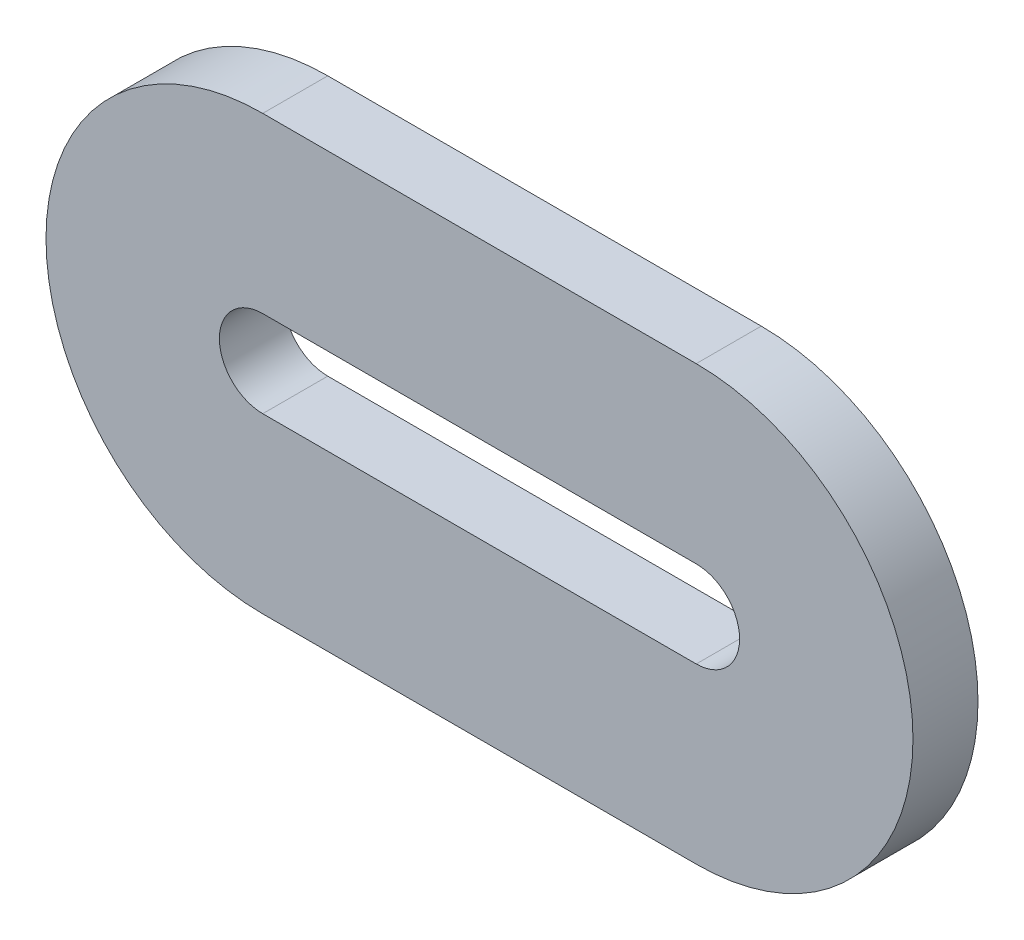
ISO-10303-21;
HEADER;
FILE_DESCRIPTION(('STEP AP214'),'2;1');
FILE_NAME('part.step','',(''),(''),'','','');
FILE_SCHEMA(('AUTOMOTIVE_DESIGN { 1 0 10303 214 1 1 1 1 }'));
ENDSEC;
DATA;
#1=APPLICATION_CONTEXT('core data for automotive mechanical design processes');
#2=APPLICATION_PROTOCOL_DEFINITION('international standard','automotive_design',2000,#1);
#3=PRODUCT_CONTEXT('',#1,'mechanical');
#4=PRODUCT('Part','Part','',(#3));
#5=PRODUCT_RELATED_PRODUCT_CATEGORY('part','',(#4));
#6=PRODUCT_DEFINITION_FORMATION('','',#4);
#7=PRODUCT_DEFINITION_CONTEXT('part definition',#1,'design');
#8=PRODUCT_DEFINITION('design','',#6,#7);
#9=PRODUCT_DEFINITION_SHAPE('','',#8);
#10=(LENGTH_UNIT() NAMED_UNIT(*) SI_UNIT(.MILLI.,.METRE.));
#11=(NAMED_UNIT(*) PLANE_ANGLE_UNIT() SI_UNIT($,.RADIAN.));
#12=(NAMED_UNIT(*) SI_UNIT($,.STERADIAN.) SOLID_ANGLE_UNIT());
#13=UNCERTAINTY_MEASURE_WITH_UNIT(LENGTH_MEASURE(1.E-05),#10,'distance_accuracy_value','');
#14=(GEOMETRIC_REPRESENTATION_CONTEXT(3) GLOBAL_UNCERTAINTY_ASSIGNED_CONTEXT((#13)) GLOBAL_UNIT_ASSIGNED_CONTEXT((#10,
#11,#12)) REPRESENTATION_CONTEXT('',''));
#15=CARTESIAN_POINT('',(0.,0.,0.));
#16=DIRECTION('',(0.,0.,1.));
#17=DIRECTION('',(1.,0.,0.));
#18=AXIS2_PLACEMENT_3D('',#15,#16,#17);
#19=CARTESIAN_POINT('',(0.,0.,3.));
#20=DIRECTION('',(0.,0.,1.));
#21=DIRECTION('',(1.,0.,0.));
#22=AXIS2_PLACEMENT_3D('',#19,#20,#21);
#23=PLANE('',#22);
#24=CARTESIAN_POINT('',(0.,0.,3.));
#25=DIRECTION('',(0.,0.,1.));
#26=DIRECTION('',(1.,0.,0.));
#27=AXIS2_PLACEMENT_3D('',#24,#25,#26);
#28=CIRCLE('',#27,10.);
#29=CARTESIAN_POINT('',(0.,10.,3.));
#30=VERTEX_POINT('',#29);
#31=CARTESIAN_POINT('',(0.,-10.,3.));
#32=VERTEX_POINT('',#31);
#33=EDGE_CURVE('E153',#30,#32,#28,.T.);
#34=ORIENTED_EDGE('',*,*,#33,.T.);
#35=DIRECTION('',(1.,0.,0.));
#36=VECTOR('',#35,1.);
#37=CARTESIAN_POINT('',(0.,-10.,3.));
#38=LINE('',#37,#36);
#39=CARTESIAN_POINT('',(20.,-10.,3.));
#40=VERTEX_POINT('',#39);
#41=EDGE_CURVE('E157',#32,#40,#38,.T.);
#42=ORIENTED_EDGE('',*,*,#41,.T.);
#43=CARTESIAN_POINT('',(20.,0.,3.));
#44=DIRECTION('',(0.,0.,1.));
#45=DIRECTION('',(1.,0.,0.));
#46=AXIS2_PLACEMENT_3D('',#43,#44,#45);
#47=CIRCLE('',#46,10.);
#48=CARTESIAN_POINT('',(20.,10.,3.));
#49=VERTEX_POINT('',#48);
#50=EDGE_CURVE('E161',#40,#49,#47,.T.);
#51=ORIENTED_EDGE('',*,*,#50,.T.);
#52=DIRECTION('',(-1.,0.,0.));
#53=VECTOR('',#52,1.);
#54=CARTESIAN_POINT('',(0.,10.,3.));
#55=LINE('',#54,#53);
#56=EDGE_CURVE('E164',#49,#30,#55,.T.);
#57=ORIENTED_EDGE('',*,*,#56,.T.);
#58=EDGE_LOOP('',(#34,#42,#51,#57));
#59=FACE_BOUND('',#58,.T.);
#60=DIRECTION('',(1.,0.,0.));
#61=VECTOR('',#60,1.);
#62=CARTESIAN_POINT('',(0.,-2.,3.));
#63=LINE('',#62,#61);
#64=CARTESIAN_POINT('',(0.,-2.,3.));
#65=VERTEX_POINT('',#64);
#66=CARTESIAN_POINT('',(20.,-2.,3.));
#67=VERTEX_POINT('',#66);
#68=EDGE_CURVE('E114',#65,#67,#63,.T.);
#69=ORIENTED_EDGE('',*,*,#68,.F.);
#70=CARTESIAN_POINT('',(0.,0.,3.));
#71=DIRECTION('',(0.,0.,1.));
#72=DIRECTION('',(1.,0.,0.));
#73=AXIS2_PLACEMENT_3D('',#70,#71,#72);
#74=CIRCLE('',#73,2.);
#75=CARTESIAN_POINT('',(0.,2.,3.));
#76=VERTEX_POINT('',#75);
#77=EDGE_CURVE('E105',#76,#65,#74,.T.);
#78=ORIENTED_EDGE('',*,*,#77,.F.);
#79=DIRECTION('',(-1.,0.,0.));
#80=VECTOR('',#79,1.);
#81=CARTESIAN_POINT('',(0.,2.,3.));
#82=LINE('',#81,#80);
#83=CARTESIAN_POINT('',(20.,2.,3.));
#84=VERTEX_POINT('',#83);
#85=EDGE_CURVE('E131',#84,#76,#82,.T.);
#86=ORIENTED_EDGE('',*,*,#85,.F.);
#87=CARTESIAN_POINT('',(20.,0.,3.));
#88=DIRECTION('',(0.,0.,1.));
#89=DIRECTION('',(1.,0.,0.));
#90=AXIS2_PLACEMENT_3D('',#87,#88,#89);
#91=CIRCLE('',#90,2.);
#92=EDGE_CURVE('E127',#67,#84,#91,.T.);
#93=ORIENTED_EDGE('',*,*,#92,.F.);
#94=EDGE_LOOP('',(#69,#78,#86,#93));
#95=FACE_BOUND('',#94,.T.);
#96=ADVANCED_FACE('F39',(#59,#95),#23,.T.);
#97=CARTESIAN_POINT('',(0.,0.,0.));
#98=DIRECTION('',(0.,0.,1.));
#99=DIRECTION('',(1.,0.,0.));
#100=AXIS2_PLACEMENT_3D('',#97,#98,#99);
#101=PLANE('',#100);
#102=CARTESIAN_POINT('',(0.,0.,0.));
#103=DIRECTION('',(0.,0.,1.));
#104=DIRECTION('',(1.,0.,0.));
#105=AXIS2_PLACEMENT_3D('',#102,#103,#104);
#106=CIRCLE('',#105,10.);
#107=CARTESIAN_POINT('',(0.,10.,0.));
#108=VERTEX_POINT('',#107);
#109=CARTESIAN_POINT('',(0.,-10.,0.));
#110=VERTEX_POINT('',#109);
#111=EDGE_CURVE('E123',#108,#110,#106,.T.);
#112=ORIENTED_EDGE('',*,*,#111,.F.);
#113=DIRECTION('',(-1.,0.,0.));
#114=VECTOR('',#113,1.);
#115=CARTESIAN_POINT('',(0.,10.,0.));
#116=LINE('',#115,#114);
#117=CARTESIAN_POINT('',(20.,10.,0.));
#118=VERTEX_POINT('',#117);
#119=EDGE_CURVE('E158',#118,#108,#116,.T.);
#120=ORIENTED_EDGE('',*,*,#119,.F.);
#121=CARTESIAN_POINT('',(20.,0.,0.));
#122=DIRECTION('',(0.,0.,1.));
#123=DIRECTION('',(1.,0.,0.));
#124=AXIS2_PLACEMENT_3D('',#121,#122,#123);
#125=CIRCLE('',#124,10.);
#126=CARTESIAN_POINT('',(20.,-10.,0.));
#127=VERTEX_POINT('',#126);
#128=EDGE_CURVE('E174',#127,#118,#125,.T.);
#129=ORIENTED_EDGE('',*,*,#128,.F.);
#130=DIRECTION('',(1.,0.,0.));
#131=VECTOR('',#130,1.);
#132=CARTESIAN_POINT('',(0.,-10.,0.));
#133=LINE('',#132,#131);
#134=EDGE_CURVE('E171',#110,#127,#133,.T.);
#135=ORIENTED_EDGE('',*,*,#134,.F.);
#136=EDGE_LOOP('',(#112,#120,#129,#135));
#137=FACE_BOUND('',#136,.T.);
#138=CARTESIAN_POINT('',(0.,0.,0.));
#139=DIRECTION('',(0.,0.,1.));
#140=DIRECTION('',(1.,0.,0.));
#141=AXIS2_PLACEMENT_3D('',#138,#139,#140);
#142=CIRCLE('',#141,2.);
#143=CARTESIAN_POINT('',(0.,2.,0.));
#144=VERTEX_POINT('',#143);
#145=CARTESIAN_POINT('',(0.,-2.,0.));
#146=VERTEX_POINT('',#145);
#147=EDGE_CURVE('E63',#144,#146,#142,.T.);
#148=ORIENTED_EDGE('',*,*,#147,.T.);
#149=DIRECTION('',(1.,0.,0.));
#150=VECTOR('',#149,1.);
#151=CARTESIAN_POINT('',(0.,-2.,0.));
#152=LINE('',#151,#150);
#153=CARTESIAN_POINT('',(20.,-2.,0.));
#154=VERTEX_POINT('',#153);
#155=EDGE_CURVE('E121',#146,#154,#152,.T.);
#156=ORIENTED_EDGE('',*,*,#155,.T.);
#157=CARTESIAN_POINT('',(20.,0.,0.));
#158=DIRECTION('',(0.,0.,1.));
#159=DIRECTION('',(1.,0.,0.));
#160=AXIS2_PLACEMENT_3D('',#157,#158,#159);
#161=CIRCLE('',#160,2.);
#162=CARTESIAN_POINT('',(20.,2.,0.));
#163=VERTEX_POINT('',#162);
#164=EDGE_CURVE('E140',#154,#163,#161,.T.);
#165=ORIENTED_EDGE('',*,*,#164,.T.);
#166=DIRECTION('',(-1.,0.,0.));
#167=VECTOR('',#166,1.);
#168=CARTESIAN_POINT('',(0.,2.,0.));
#169=LINE('',#168,#167);
#170=EDGE_CURVE('E115',#163,#144,#169,.T.);
#171=ORIENTED_EDGE('',*,*,#170,.T.);
#172=EDGE_LOOP('',(#148,#156,#165,#171));
#173=FACE_BOUND('',#172,.T.);
#174=ADVANCED_FACE('F197',(#137,#173),#101,.F.);
#175=CARTESIAN_POINT('',(0.,0.,3.));
#176=DIRECTION('',(0.,0.,-1.));
#177=DIRECTION('',(-1.,0.,0.));
#178=AXIS2_PLACEMENT_3D('',#175,#176,#177);
#179=CYLINDRICAL_SURFACE('',#178,10.);
#180=ORIENTED_EDGE('',*,*,#111,.T.);
#181=DIRECTION('',(0.,0.,-1.));
#182=VECTOR('',#181,1.);
#183=CARTESIAN_POINT('',(0.,-10.,3.));
#184=LINE('',#183,#182);
#185=EDGE_CURVE('E11',#32,#110,#184,.T.);
#186=ORIENTED_EDGE('',*,*,#185,.F.);
#187=ORIENTED_EDGE('',*,*,#33,.F.);
#188=DIRECTION('',(0.,0.,-1.));
#189=VECTOR('',#188,1.);
#190=CARTESIAN_POINT('',(0.,10.,3.));
#191=LINE('',#190,#189);
#192=EDGE_CURVE('E167',#30,#108,#191,.T.);
#193=ORIENTED_EDGE('',*,*,#192,.T.);
#194=EDGE_LOOP('',(#180,#186,#187,#193));
#195=FACE_BOUND('',#194,.T.);
#196=ADVANCED_FACE('F41',(#195),#179,.T.);
#197=CARTESIAN_POINT('',(0.,-10.,3.));
#198=DIRECTION('',(0.,1.,0.));
#199=DIRECTION('',(-1.,0.,0.));
#200=AXIS2_PLACEMENT_3D('',#197,#198,#199);
#201=PLANE('',#200);
#202=ORIENTED_EDGE('',*,*,#134,.T.);
#203=DIRECTION('',(0.,0.,-1.));
#204=VECTOR('',#203,1.);
#205=CARTESIAN_POINT('',(20.,-10.,3.));
#206=LINE('',#205,#204);
#207=EDGE_CURVE('E48',#40,#127,#206,.T.);
#208=ORIENTED_EDGE('',*,*,#207,.F.);
#209=ORIENTED_EDGE('',*,*,#41,.F.);
#210=ORIENTED_EDGE('',*,*,#185,.T.);
#211=EDGE_LOOP('',(#202,#208,#209,#210));
#212=FACE_BOUND('',#211,.T.);
#213=ADVANCED_FACE('F207',(#212),#201,.F.);
#214=CARTESIAN_POINT('',(20.,0.,3.));
#215=DIRECTION('',(0.,0.,-1.));
#216=DIRECTION('',(-1.,0.,0.));
#217=AXIS2_PLACEMENT_3D('',#214,#215,#216);
#218=CYLINDRICAL_SURFACE('',#217,10.);
#219=ORIENTED_EDGE('',*,*,#128,.T.);
#220=DIRECTION('',(0.,0.,-1.));
#221=VECTOR('',#220,1.);
#222=CARTESIAN_POINT('',(20.,10.,3.));
#223=LINE('',#222,#221);
#224=EDGE_CURVE('E182',#49,#118,#223,.T.);
#225=ORIENTED_EDGE('',*,*,#224,.F.);
#226=ORIENTED_EDGE('',*,*,#50,.F.);
#227=ORIENTED_EDGE('',*,*,#207,.T.);
#228=EDGE_LOOP('',(#219,#225,#226,#227));
#229=FACE_BOUND('',#228,.T.);
#230=ADVANCED_FACE('F191',(#229),#218,.T.);
#231=CARTESIAN_POINT('',(0.,10.,3.));
#232=DIRECTION('',(0.,-1.,0.));
#233=DIRECTION('',(1.,0.,0.));
#234=AXIS2_PLACEMENT_3D('',#231,#232,#233);
#235=PLANE('',#234);
#236=ORIENTED_EDGE('',*,*,#119,.T.);
#237=ORIENTED_EDGE('',*,*,#192,.F.);
#238=ORIENTED_EDGE('',*,*,#56,.F.);
#239=ORIENTED_EDGE('',*,*,#224,.T.);
#240=EDGE_LOOP('',(#236,#237,#238,#239));
#241=FACE_BOUND('',#240,.T.);
#242=ADVANCED_FACE('F201',(#241),#235,.F.);
#243=CARTESIAN_POINT('',(0.,0.,3.));
#244=DIRECTION('',(0.,0.,-1.));
#245=DIRECTION('',(-1.,0.,0.));
#246=AXIS2_PLACEMENT_3D('',#243,#244,#245);
#247=CYLINDRICAL_SURFACE('',#246,2.);
#248=ORIENTED_EDGE('',*,*,#147,.F.);
#249=DIRECTION('',(0.,0.,-1.));
#250=VECTOR('',#249,1.);
#251=CARTESIAN_POINT('',(0.,2.,3.));
#252=LINE('',#251,#250);
#253=EDGE_CURVE('E109',#76,#144,#252,.T.);
#254=ORIENTED_EDGE('',*,*,#253,.F.);
#255=ORIENTED_EDGE('',*,*,#77,.T.);
#256=DIRECTION('',(0.,0.,-1.));
#257=VECTOR('',#256,1.);
#258=CARTESIAN_POINT('',(0.,-2.,3.));
#259=LINE('',#258,#257);
#260=EDGE_CURVE('E108',#65,#146,#259,.T.);
#261=ORIENTED_EDGE('',*,*,#260,.T.);
#262=EDGE_LOOP('',(#248,#254,#255,#261));
#263=FACE_BOUND('',#262,.T.);
#264=ADVANCED_FACE('F107',(#263),#247,.F.);
#265=CARTESIAN_POINT('',(0.,-2.,3.));
#266=DIRECTION('',(0.,1.,0.));
#267=DIRECTION('',(0.,0.,1.));
#268=AXIS2_PLACEMENT_3D('',#265,#266,#267);
#269=PLANE('',#268);
#270=ORIENTED_EDGE('',*,*,#155,.F.);
#271=ORIENTED_EDGE('',*,*,#260,.F.);
#272=ORIENTED_EDGE('',*,*,#68,.T.);
#273=DIRECTION('',(0.,0.,-1.));
#274=VECTOR('',#273,1.);
#275=CARTESIAN_POINT('',(20.,-2.,3.));
#276=LINE('',#275,#274);
#277=EDGE_CURVE('E124',#67,#154,#276,.T.);
#278=ORIENTED_EDGE('',*,*,#277,.T.);
#279=EDGE_LOOP('',(#270,#271,#272,#278));
#280=FACE_BOUND('',#279,.T.);
#281=ADVANCED_FACE('F118',(#280),#269,.T.);
#282=CARTESIAN_POINT('',(20.,0.,3.));
#283=DIRECTION('',(0.,0.,-1.));
#284=DIRECTION('',(-1.,0.,0.));
#285=AXIS2_PLACEMENT_3D('',#282,#283,#284);
#286=CYLINDRICAL_SURFACE('',#285,2.);
#287=ORIENTED_EDGE('',*,*,#164,.F.);
#288=ORIENTED_EDGE('',*,*,#277,.F.);
#289=ORIENTED_EDGE('',*,*,#92,.T.);
#290=DIRECTION('',(0.,0.,-1.));
#291=VECTOR('',#290,1.);
#292=CARTESIAN_POINT('',(20.,2.,3.));
#293=LINE('',#292,#291);
#294=EDGE_CURVE('E55',#84,#163,#293,.T.);
#295=ORIENTED_EDGE('',*,*,#294,.T.);
#296=EDGE_LOOP('',(#287,#288,#289,#295));
#297=FACE_BOUND('',#296,.T.);
#298=ADVANCED_FACE('F230',(#297),#286,.F.);
#299=CARTESIAN_POINT('',(0.,2.,3.));
#300=DIRECTION('',(0.,-1.,0.));
#301=DIRECTION('',(0.,0.,-1.));
#302=AXIS2_PLACEMENT_3D('',#299,#300,#301);
#303=PLANE('',#302);
#304=ORIENTED_EDGE('',*,*,#170,.F.);
#305=ORIENTED_EDGE('',*,*,#294,.F.);
#306=ORIENTED_EDGE('',*,*,#85,.T.);
#307=ORIENTED_EDGE('',*,*,#253,.T.);
#308=EDGE_LOOP('',(#304,#305,#306,#307));
#309=FACE_BOUND('',#308,.T.);
#310=ADVANCED_FACE('F234',(#309),#303,.T.);
#311=CLOSED_SHELL('',(#96,#174,#196,#213,#230,#242,#264,#281,#298,#310));
#312=MANIFOLD_SOLID_BREP('B2',#311);
#313=ADVANCED_BREP_SHAPE_REPRESENTATION('',(#18,#312),#14);
#314=SHAPE_DEFINITION_REPRESENTATION(#9,#313);
ENDSEC;
END-ISO-10303-21;
